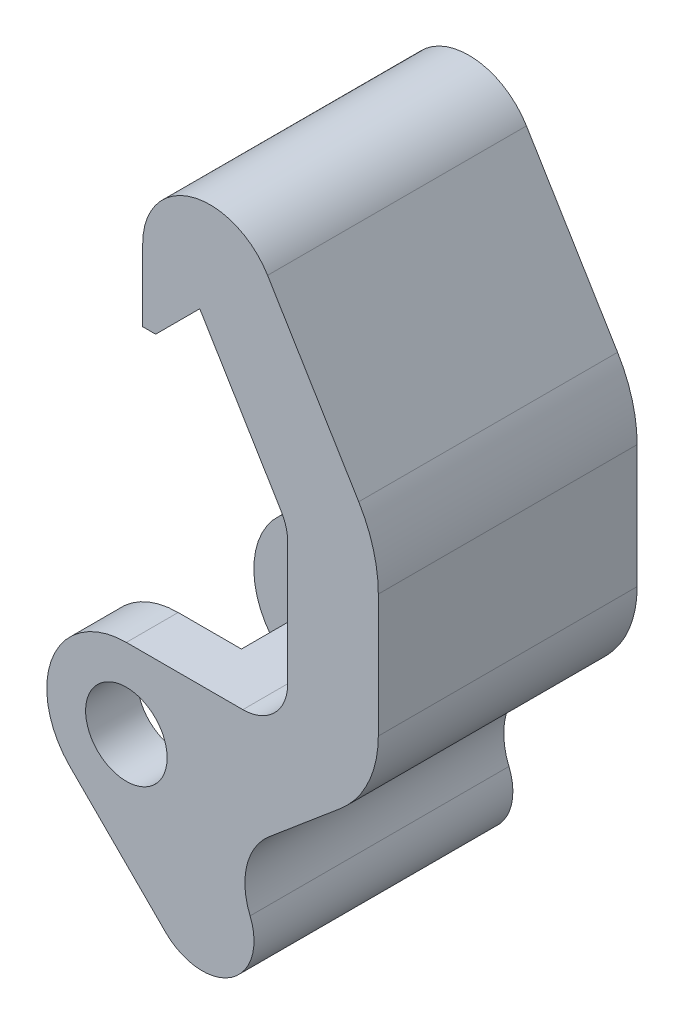
ISO-10303-21;
HEADER;
FILE_DESCRIPTION(('STEP AP214'),'2;1');
FILE_NAME('part.step','',(''),(''),'','','');
FILE_SCHEMA(('AUTOMOTIVE_DESIGN { 1 0 10303 214 1 1 1 1 }'));
ENDSEC;
DATA;
#1=APPLICATION_CONTEXT('core data for automotive mechanical design processes');
#2=APPLICATION_PROTOCOL_DEFINITION('international standard','automotive_design',2000,#1);
#3=PRODUCT_CONTEXT('',#1,'mechanical');
#4=PRODUCT('Part','Part','',(#3));
#5=PRODUCT_RELATED_PRODUCT_CATEGORY('part','',(#4));
#6=PRODUCT_DEFINITION_FORMATION('','',#4);
#7=PRODUCT_DEFINITION_CONTEXT('part definition',#1,'design');
#8=PRODUCT_DEFINITION('design','',#6,#7);
#9=PRODUCT_DEFINITION_SHAPE('','',#8);
#10=(LENGTH_UNIT() NAMED_UNIT(*) SI_UNIT(.MILLI.,.METRE.));
#11=(NAMED_UNIT(*) PLANE_ANGLE_UNIT() SI_UNIT($,.RADIAN.));
#12=(NAMED_UNIT(*) SI_UNIT($,.STERADIAN.) SOLID_ANGLE_UNIT());
#13=UNCERTAINTY_MEASURE_WITH_UNIT(LENGTH_MEASURE(1.E-05),#10,'distance_accuracy_value','');
#14=(GEOMETRIC_REPRESENTATION_CONTEXT(3) GLOBAL_UNCERTAINTY_ASSIGNED_CONTEXT((#13)) GLOBAL_UNIT_ASSIGNED_CONTEXT((#10,
#11,#12)) REPRESENTATION_CONTEXT('',''));
#15=CARTESIAN_POINT('',(0.,0.,0.));
#16=DIRECTION('',(0.,0.,1.));
#17=DIRECTION('',(1.,0.,0.));
#18=AXIS2_PLACEMENT_3D('',#15,#16,#17);
#19=CARTESIAN_POINT('',(0.,3.075,5.));
#20=DIRECTION('',(0.,-1.,0.));
#21=DIRECTION('',(1.,0.,0.));
#22=AXIS2_PLACEMENT_3D('',#19,#20,#21);
#23=PLANE('',#22);
#24=DIRECTION('',(-1.,0.,0.));
#25=VECTOR('',#24,1.);
#26=CARTESIAN_POINT('',(0.,3.075,-3.));
#27=LINE('',#26,#25);
#28=CARTESIAN_POINT('',(2.44513023030322,3.075,-3.));
#29=VERTEX_POINT('',#28);
#30=CARTESIAN_POINT('',(0.,3.075,-3.));
#31=VERTEX_POINT('',#30);
#32=EDGE_CURVE('E275',#29,#31,#27,.T.);
#33=ORIENTED_EDGE('',*,*,#32,.F.);
#34=DIRECTION('',(0.,0.,1.));
#35=VECTOR('',#34,1.);
#36=CARTESIAN_POINT('',(2.44513023030322,3.075,-3.));
#37=LINE('',#36,#35);
#38=CARTESIAN_POINT('',(2.44513023030322,3.075,3.));
#39=VERTEX_POINT('',#38);
#40=EDGE_CURVE('E278',#29,#39,#37,.T.);
#41=ORIENTED_EDGE('',*,*,#40,.T.);
#42=DIRECTION('',(-1.,0.,0.));
#43=VECTOR('',#42,1.);
#44=CARTESIAN_POINT('',(0.,3.075,3.));
#45=LINE('',#44,#43);
#46=CARTESIAN_POINT('',(0.,3.075,3.));
#47=VERTEX_POINT('',#46);
#48=EDGE_CURVE('E256',#39,#47,#45,.T.);
#49=ORIENTED_EDGE('',*,*,#48,.T.);
#50=DIRECTION('',(0.,0.,-1.));
#51=VECTOR('',#50,1.);
#52=CARTESIAN_POINT('',(0.,3.075,5.));
#53=LINE('',#52,#51);
#54=CARTESIAN_POINT('',(0.,3.075,5.));
#55=VERTEX_POINT('',#54);
#56=EDGE_CURVE('E209',#55,#47,#53,.T.);
#57=ORIENTED_EDGE('',*,*,#56,.F.);
#58=DIRECTION('',(-1.,0.,0.));
#59=VECTOR('',#58,1.);
#60=CARTESIAN_POINT('',(0.,3.075,5.));
#61=LINE('',#60,#59);
#62=CARTESIAN_POINT('',(4.5,3.075,5.));
#63=VERTEX_POINT('',#62);
#64=EDGE_CURVE('E323',#63,#55,#61,.T.);
#65=ORIENTED_EDGE('',*,*,#64,.F.);
#66=DIRECTION('',(0.,0.,-1.));
#67=VECTOR('',#66,1.);
#68=CARTESIAN_POINT('',(4.5,3.075,5.));
#69=LINE('',#68,#67);
#70=CARTESIAN_POINT('',(4.5,3.075,-5.));
#71=VERTEX_POINT('',#70);
#72=EDGE_CURVE('E212',#63,#71,#69,.T.);
#73=ORIENTED_EDGE('',*,*,#72,.T.);
#74=DIRECTION('',(-1.,0.,0.));
#75=VECTOR('',#74,1.);
#76=CARTESIAN_POINT('',(0.,3.075,-5.));
#77=LINE('',#76,#75);
#78=CARTESIAN_POINT('',(0.,3.075,-5.));
#79=VERTEX_POINT('',#78);
#80=EDGE_CURVE('E368',#71,#79,#77,.T.);
#81=ORIENTED_EDGE('',*,*,#80,.T.);
#82=EDGE_CURVE('E208',#31,#79,#53,.T.);
#83=ORIENTED_EDGE('',*,*,#82,.F.);
#84=EDGE_LOOP('',(#33,#41,#49,#57,#65,#73,#81,#83));
#85=FACE_BOUND('',#84,.T.);
#86=ADVANCED_FACE('F38',(#85),#23,.F.);
#87=CARTESIAN_POINT('',(0.,0.,5.));
#88=DIRECTION('',(0.,0.,-1.));
#89=DIRECTION('',(-1.,0.,0.));
#90=AXIS2_PLACEMENT_3D('',#87,#88,#89);
#91=CYLINDRICAL_SURFACE('',#90,3.075);
#92=CARTESIAN_POINT('',(0.,0.,-3.));
#93=DIRECTION('',(0.,0.,1.));
#94=DIRECTION('',(1.,0.,0.));
#95=AXIS2_PLACEMENT_3D('',#92,#93,#94);
#96=CIRCLE('',#95,3.075);
#97=CARTESIAN_POINT('',(-2.17435335214862,-2.17435335214865,-3.));
#98=VERTEX_POINT('',#97);
#99=EDGE_CURVE('E260',#31,#98,#96,.T.);
#100=ORIENTED_EDGE('',*,*,#99,.F.);
#101=ORIENTED_EDGE('',*,*,#82,.T.);
#102=CARTESIAN_POINT('',(0.,0.,-5.));
#103=DIRECTION('',(0.,0.,1.));
#104=DIRECTION('',(1.,0.,0.));
#105=AXIS2_PLACEMENT_3D('',#102,#103,#104);
#106=CIRCLE('',#105,3.075);
#107=CARTESIAN_POINT('',(-2.17435335214862,-2.17435335214865,-5.));
#108=VERTEX_POINT('',#107);
#109=EDGE_CURVE('E371',#79,#108,#106,.T.);
#110=ORIENTED_EDGE('',*,*,#109,.T.);
#111=DIRECTION('',(0.,0.,-1.));
#112=VECTOR('',#111,1.);
#113=CARTESIAN_POINT('',(-2.17435335214862,-2.17435335214865,5.));
#114=LINE('',#113,#112);
#115=EDGE_CURVE('E201',#98,#108,#114,.T.);
#116=ORIENTED_EDGE('',*,*,#115,.F.);
#117=EDGE_LOOP('',(#100,#101,#110,#116));
#118=FACE_BOUND('',#117,.T.);
#119=ADVANCED_FACE('F395',(#118),#91,.T.);
#120=CARTESIAN_POINT('',(-2.17435335214862,-2.17435335214865,5.));
#121=DIRECTION('',(0.707106781186544,0.707106781186551,0.));
#122=DIRECTION('',(-0.707106781186551,0.707106781186544,0.));
#123=AXIS2_PLACEMENT_3D('',#120,#121,#122);
#124=PLANE('',#123);
#125=DIRECTION('',(0.707106781186551,-0.707106781186544,0.));
#126=VECTOR('',#125,1.);
#127=CARTESIAN_POINT('',(-2.17435335214862,-2.17435335214865,-3.));
#128=LINE('',#127,#126);
#129=CARTESIAN_POINT('',(-0.445385185416979,-3.90332151888027,-3.));
#130=VERTEX_POINT('',#129);
#131=EDGE_CURVE('E255',#98,#130,#128,.T.);
#132=ORIENTED_EDGE('',*,*,#131,.F.);
#133=ORIENTED_EDGE('',*,*,#115,.T.);
#134=DIRECTION('',(0.707106781186551,-0.707106781186544,0.));
#135=VECTOR('',#134,1.);
#136=CARTESIAN_POINT('',(-2.17435335214862,-2.17435335214865,-5.));
#137=LINE('',#136,#135);
#138=CARTESIAN_POINT('',(1.5171263132626,-5.86583301755982,-5.));
#139=VERTEX_POINT('',#138);
#140=EDGE_CURVE('E200',#108,#139,#137,.T.);
#141=ORIENTED_EDGE('',*,*,#140,.T.);
#142=DIRECTION('',(0.,0.,-1.));
#143=VECTOR('',#142,1.);
#144=CARTESIAN_POINT('',(1.5171263132626,-5.86583301755982,5.));
#145=LINE('',#144,#143);
#146=CARTESIAN_POINT('',(1.5171263132626,-5.86583301755982,5.));
#147=VERTEX_POINT('',#146);
#148=EDGE_CURVE('E183',#147,#139,#145,.T.);
#149=ORIENTED_EDGE('',*,*,#148,.F.);
#150=DIRECTION('',(0.707106781186551,-0.707106781186544,0.));
#151=VECTOR('',#150,1.);
#152=CARTESIAN_POINT('',(-2.17435335214862,-2.17435335214865,5.));
#153=LINE('',#152,#151);
#154=CARTESIAN_POINT('',(-2.17435335214862,-2.17435335214865,5.));
#155=VERTEX_POINT('',#154);
#156=EDGE_CURVE('E187',#155,#147,#153,.T.);
#157=ORIENTED_EDGE('',*,*,#156,.F.);
#158=CARTESIAN_POINT('',(-2.17435335214862,-2.17435335214865,3.));
#159=VERTEX_POINT('',#158);
#160=EDGE_CURVE('E203',#155,#159,#114,.T.);
#161=ORIENTED_EDGE('',*,*,#160,.T.);
#162=DIRECTION('',(0.707106781186551,-0.707106781186544,0.));
#163=VECTOR('',#162,1.);
#164=CARTESIAN_POINT('',(-2.17435335214862,-2.17435335214865,3.));
#165=LINE('',#164,#163);
#166=CARTESIAN_POINT('',(-0.445385185416979,-3.90332151888027,3.));
#167=VERTEX_POINT('',#166);
#168=EDGE_CURVE('E251',#159,#167,#165,.T.);
#169=ORIENTED_EDGE('',*,*,#168,.T.);
#170=DIRECTION('',(0.,0.,1.));
#171=VECTOR('',#170,1.);
#172=CARTESIAN_POINT('',(-0.445385185416979,-3.90332151888027,-3.));
#173=LINE('',#172,#171);
#174=EDGE_CURVE('E11',#167,#130,#173,.F.);
#175=ORIENTED_EDGE('',*,*,#174,.T.);
#176=EDGE_LOOP('',(#132,#133,#141,#149,#157,#161,#169,#175));
#177=FACE_BOUND('',#176,.T.);
#178=ADVANCED_FACE('F198',(#177),#124,.F.);
#179=CARTESIAN_POINT('',(0.,0.,5.));
#180=DIRECTION('',(0.,0.,-1.));
#181=DIRECTION('',(-1.,0.,0.));
#182=AXIS2_PLACEMENT_3D('',#179,#180,#181);
#183=CYLINDRICAL_SURFACE('',#182,1.575);
#184=CARTESIAN_POINT('',(0.,0.,-5.));
#185=DIRECTION('',(0.,0.,1.));
#186=DIRECTION('',(1.,0.,0.));
#187=AXIS2_PLACEMENT_3D('',#184,#185,#186);
#188=CIRCLE('',#187,1.575);
#189=CARTESIAN_POINT('',(1.575,0.,-5.));
#190=VERTEX_POINT('',#189);
#191=EDGE_CURVE('E280',#190,#190,#188,.T.);
#192=ORIENTED_EDGE('',*,*,#191,.F.);
#193=EDGE_LOOP('',(#192));
#194=FACE_BOUND('',#193,.T.);
#195=CARTESIAN_POINT('',(0.,0.,-3.));
#196=DIRECTION('',(0.,0.,1.));
#197=DIRECTION('',(1.,0.,0.));
#198=AXIS2_PLACEMENT_3D('',#195,#196,#197);
#199=CIRCLE('',#198,1.575);
#200=CARTESIAN_POINT('',(1.575,0.,-3.));
#201=VERTEX_POINT('',#200);
#202=EDGE_CURVE('E253',#201,#201,#199,.T.);
#203=ORIENTED_EDGE('',*,*,#202,.T.);
#204=EDGE_LOOP('',(#203));
#205=FACE_BOUND('',#204,.T.);
#206=ADVANCED_FACE('F385',(#194,#205),#183,.F.);
#207=CARTESIAN_POINT('',(2.61848265699495,-3.10888468855235,5.));
#208=DIRECTION('',(0.644204044734326,-0.764853677998566,0.));
#209=DIRECTION('',(0.764853677998566,0.644204044734326,0.));
#210=AXIS2_PLACEMENT_3D('',#207,#208,#209);
#211=PLANE('',#210);
#212=DIRECTION('',(-0.764853677998566,-0.644204044734326,0.));
#213=VECTOR('',#212,1.);
#214=CARTESIAN_POINT('',(2.61848265699495,-3.10888468855235,-5.));
#215=LINE('',#214,#213);
#216=CARTESIAN_POINT('',(8.26048453199489,1.64313590417654,-5.));
#217=VERTEX_POINT('',#216);
#218=CARTESIAN_POINT('',(5.51326964630779,-0.670727507901209,-5.));
#219=VERTEX_POINT('',#218);
#220=EDGE_CURVE('E329',#217,#219,#215,.T.);
#221=ORIENTED_EDGE('',*,*,#220,.F.);
#222=DIRECTION('',(0.,0.,-1.));
#223=VECTOR('',#222,1.);
#224=CARTESIAN_POINT('',(8.26048453199489,1.64313590417654,5.));
#225=LINE('',#224,#223);
#226=CARTESIAN_POINT('',(8.26048453199489,1.64313590417654,5.));
#227=VERTEX_POINT('',#226);
#228=EDGE_CURVE('E46',#227,#217,#225,.T.);
#229=ORIENTED_EDGE('',*,*,#228,.F.);
#230=DIRECTION('',(-0.764853677998566,-0.644204044734326,0.));
#231=VECTOR('',#230,1.);
#232=CARTESIAN_POINT('',(2.61848265699495,-3.10888468855235,5.));
#233=LINE('',#232,#231);
#234=CARTESIAN_POINT('',(5.51326964630779,-0.670727507901209,5.));
#235=VERTEX_POINT('',#234);
#236=EDGE_CURVE('E284',#227,#235,#233,.T.);
#237=ORIENTED_EDGE('',*,*,#236,.T.);
#238=DIRECTION('',(0.,0.,-1.));
#239=VECTOR('',#238,1.);
#240=CARTESIAN_POINT('',(5.51326964630779,-0.670727507901209,5.));
#241=LINE('',#240,#239);
#242=EDGE_CURVE('E125',#235,#219,#241,.T.);
#243=ORIENTED_EDGE('',*,*,#242,.T.);
#244=EDGE_LOOP('',(#221,#229,#237,#243));
#245=FACE_BOUND('',#244,.T.);
#246=ADVANCED_FACE('F382',(#245),#211,.T.);
#247=CARTESIAN_POINT('',(5.59529140507463,4.80747922422185,5.));
#248=DIRECTION('',(0.,0.,-1.));
#249=DIRECTION('',(-1.,0.,0.));
#250=AXIS2_PLACEMENT_3D('',#247,#248,#249);
#251=CYLINDRICAL_SURFACE('',#250,4.13718781914711);
#252=CARTESIAN_POINT('',(5.59529140507463,4.80747922422185,-5.));
#253=DIRECTION('',(0.,0.,1.));
#254=DIRECTION('',(1.,0.,0.));
#255=AXIS2_PLACEMENT_3D('',#252,#253,#254);
#256=CIRCLE('',#255,4.13718781914711);
#257=CARTESIAN_POINT('',(9.73247922422185,4.80747922422208,-5.));
#258=VERTEX_POINT('',#257);
#259=EDGE_CURVE('E332',#217,#258,#256,.T.);
#260=ORIENTED_EDGE('',*,*,#259,.T.);
#261=DIRECTION('',(0.,0.,-1.));
#262=VECTOR('',#261,1.);
#263=CARTESIAN_POINT('',(9.73247922422185,4.80747922422208,5.));
#264=LINE('',#263,#262);
#265=CARTESIAN_POINT('',(9.73247922422185,4.80747922422208,5.));
#266=VERTEX_POINT('',#265);
#267=EDGE_CURVE('E245',#266,#258,#264,.T.);
#268=ORIENTED_EDGE('',*,*,#267,.F.);
#269=CARTESIAN_POINT('',(5.59529140507463,4.80747922422185,5.));
#270=DIRECTION('',(0.,0.,1.));
#271=DIRECTION('',(1.,0.,0.));
#272=AXIS2_PLACEMENT_3D('',#269,#270,#271);
#273=CIRCLE('',#272,4.13718781914711);
#274=EDGE_CURVE('E287',#227,#266,#273,.T.);
#275=ORIENTED_EDGE('',*,*,#274,.F.);
#276=ORIENTED_EDGE('',*,*,#228,.T.);
#277=EDGE_LOOP('',(#260,#268,#275,#276));
#278=FACE_BOUND('',#277,.T.);
#279=ADVANCED_FACE('F384',(#278),#251,.T.);
#280=CARTESIAN_POINT('',(9.73247922422185,0.,5.));
#281=DIRECTION('',(-1.,0.,0.));
#282=DIRECTION('',(0.,-1.,0.));
#283=AXIS2_PLACEMENT_3D('',#280,#281,#282);
#284=PLANE('',#283);
#285=DIRECTION('',(0.,1.,0.));
#286=VECTOR('',#285,1.);
#287=CARTESIAN_POINT('',(9.73247922422185,0.,-5.));
#288=LINE('',#287,#286);
#289=CARTESIAN_POINT('',(9.73247922422185,9.55747922422185,-5.));
#290=VERTEX_POINT('',#289);
#291=EDGE_CURVE('E335',#258,#290,#288,.T.);
#292=ORIENTED_EDGE('',*,*,#291,.T.);
#293=DIRECTION('',(0.,0.,-1.));
#294=VECTOR('',#293,1.);
#295=CARTESIAN_POINT('',(9.73247922422185,9.55747922422185,5.));
#296=LINE('',#295,#294);
#297=CARTESIAN_POINT('',(9.73247922422185,9.55747922422185,5.));
#298=VERTEX_POINT('',#297);
#299=EDGE_CURVE('E242',#298,#290,#296,.T.);
#300=ORIENTED_EDGE('',*,*,#299,.F.);
#301=DIRECTION('',(0.,1.,0.));
#302=VECTOR('',#301,1.);
#303=CARTESIAN_POINT('',(9.73247922422185,0.,5.));
#304=LINE('',#303,#302);
#305=EDGE_CURVE('E290',#266,#298,#304,.T.);
#306=ORIENTED_EDGE('',*,*,#305,.F.);
#307=ORIENTED_EDGE('',*,*,#267,.T.);
#308=EDGE_LOOP('',(#292,#300,#306,#307));
#309=FACE_BOUND('',#308,.T.);
#310=ADVANCED_FACE('F390',(#309),#284,.F.);
#311=CARTESIAN_POINT('',(4.5,9.55747922422185,5.));
#312=DIRECTION('',(0.,0.,-1.));
#313=DIRECTION('',(-1.,0.,0.));
#314=AXIS2_PLACEMENT_3D('',#311,#312,#313);
#315=CYLINDRICAL_SURFACE('',#314,5.23247922422185);
#316=CARTESIAN_POINT('',(4.5,9.55747922422185,-5.));
#317=DIRECTION('',(0.,0.,1.));
#318=DIRECTION('',(1.,0.,0.));
#319=AXIS2_PLACEMENT_3D('',#316,#317,#318);
#320=CIRCLE('',#319,5.23247922422185);
#321=CARTESIAN_POINT('',(8.97613150360783,12.2672920580395,-5.));
#322=VERTEX_POINT('',#321);
#323=EDGE_CURVE('E338',#290,#322,#320,.T.);
#324=ORIENTED_EDGE('',*,*,#323,.T.);
#325=DIRECTION('',(0.,0.,-1.));
#326=VECTOR('',#325,1.);
#327=CARTESIAN_POINT('',(8.97613150360783,12.2672920580395,5.));
#328=LINE('',#327,#326);
#329=CARTESIAN_POINT('',(8.97613150360783,12.2672920580395,5.));
#330=VERTEX_POINT('',#329);
#331=EDGE_CURVE('E239',#330,#322,#328,.T.);
#332=ORIENTED_EDGE('',*,*,#331,.F.);
#333=CARTESIAN_POINT('',(4.5,9.55747922422185,5.));
#334=DIRECTION('',(0.,0.,1.));
#335=DIRECTION('',(1.,0.,0.));
#336=AXIS2_PLACEMENT_3D('',#333,#334,#335);
#337=CIRCLE('',#336,5.23247922422185);
#338=EDGE_CURVE('E293',#298,#330,#337,.T.);
#339=ORIENTED_EDGE('',*,*,#338,.F.);
#340=ORIENTED_EDGE('',*,*,#299,.T.);
#341=EDGE_LOOP('',(#324,#332,#339,#340));
#342=FACE_BOUND('',#341,.T.);
#343=ADVANCED_FACE('F441',(#342),#315,.T.);
#344=CARTESIAN_POINT('',(12.0034094316589,7.26676437036306,5.));
#345=DIRECTION('',(-0.855451366703419,-0.517883152077041,0.));
#346=DIRECTION('',(0.517883152077041,-0.855451366703419,0.));
#347=AXIS2_PLACEMENT_3D('',#344,#345,#346);
#348=PLANE('',#347);
#349=DIRECTION('',(-0.517883152077041,0.855451366703419,0.));
#350=VECTOR('',#349,1.);
#351=CARTESIAN_POINT('',(12.0034094316589,7.26676437036306,-5.));
#352=LINE('',#351,#350);
#353=CARTESIAN_POINT('',(5.45563764844864,18.0825252197835,-5.));
#354=VERTEX_POINT('',#353);
#355=EDGE_CURVE('E341',#322,#354,#352,.T.);
#356=ORIENTED_EDGE('',*,*,#355,.T.);
#357=DIRECTION('',(0.,0.,-1.));
#358=VECTOR('',#357,1.);
#359=CARTESIAN_POINT('',(5.45563764844864,18.0825252197835,5.));
#360=LINE('',#359,#358);
#361=CARTESIAN_POINT('',(5.45563764844864,18.0825252197835,5.));
#362=VERTEX_POINT('',#361);
#363=EDGE_CURVE('E236',#362,#354,#360,.T.);
#364=ORIENTED_EDGE('',*,*,#363,.F.);
#365=DIRECTION('',(-0.517883152077041,0.855451366703419,0.));
#366=VECTOR('',#365,1.);
#367=CARTESIAN_POINT('',(12.0034094316589,7.26676437036306,5.));
#368=LINE('',#367,#366);
#369=EDGE_CURVE('E296',#330,#362,#368,.T.);
#370=ORIENTED_EDGE('',*,*,#369,.F.);
#371=ORIENTED_EDGE('',*,*,#331,.T.);
#372=EDGE_LOOP('',(#356,#364,#370,#371));
#373=FACE_BOUND('',#372,.T.);
#374=ADVANCED_FACE('F437',(#373),#348,.F.);
#375=CARTESIAN_POINT('',(3.23135063648235,16.735960337527,5.));
#376=DIRECTION('',(0.,0.,-1.));
#377=DIRECTION('',(-1.,0.,0.));
#378=AXIS2_PLACEMENT_3D('',#375,#376,#377);
#379=CYLINDRICAL_SURFACE('',#378,2.60013263002645);
#380=CARTESIAN_POINT('',(3.23135063648235,16.735960337527,-5.));
#381=DIRECTION('',(0.,0.,1.));
#382=DIRECTION('',(1.,0.,0.));
#383=AXIS2_PLACEMENT_3D('',#380,#381,#382);
#384=CIRCLE('',#383,2.60013263002645);
#385=CARTESIAN_POINT('',(0.631218006455897,16.735960337527,-5.));
#386=VERTEX_POINT('',#385);
#387=EDGE_CURVE('E344',#354,#386,#384,.T.);
#388=ORIENTED_EDGE('',*,*,#387,.T.);
#389=DIRECTION('',(0.,0.,-1.));
#390=VECTOR('',#389,1.);
#391=CARTESIAN_POINT('',(0.631218006455897,16.735960337527,5.));
#392=LINE('',#391,#390);
#393=CARTESIAN_POINT('',(0.631218006455897,16.735960337527,5.));
#394=VERTEX_POINT('',#393);
#395=EDGE_CURVE('E233',#394,#386,#392,.T.);
#396=ORIENTED_EDGE('',*,*,#395,.F.);
#397=CARTESIAN_POINT('',(3.23135063648235,16.735960337527,5.));
#398=DIRECTION('',(0.,0.,1.));
#399=DIRECTION('',(1.,0.,0.));
#400=AXIS2_PLACEMENT_3D('',#397,#398,#399);
#401=CIRCLE('',#400,2.60013263002645);
#402=EDGE_CURVE('E299',#362,#394,#401,.T.);
#403=ORIENTED_EDGE('',*,*,#402,.F.);
#404=ORIENTED_EDGE('',*,*,#363,.T.);
#405=EDGE_LOOP('',(#388,#396,#403,#404));
#406=FACE_BOUND('',#405,.T.);
#407=ADVANCED_FACE('F433',(#406),#379,.T.);
#408=CARTESIAN_POINT('',(0.631218006455931,0.,5.));
#409=DIRECTION('',(1.,0.,0.));
#410=DIRECTION('',(0.,1.,0.));
#411=AXIS2_PLACEMENT_3D('',#408,#409,#410);
#412=PLANE('',#411);
#413=DIRECTION('',(0.,-1.,0.));
#414=VECTOR('',#413,1.);
#415=CARTESIAN_POINT('',(0.631218006455931,0.,-5.));
#416=LINE('',#415,#414);
#417=CARTESIAN_POINT('',(0.631218006455902,13.9500746322776,-5.));
#418=VERTEX_POINT('',#417);
#419=EDGE_CURVE('E347',#386,#418,#416,.T.);
#420=ORIENTED_EDGE('',*,*,#419,.T.);
#421=DIRECTION('',(0.,0.,-1.));
#422=VECTOR('',#421,1.);
#423=CARTESIAN_POINT('',(0.631218006455902,13.9500746322776,5.));
#424=LINE('',#423,#422);
#425=CARTESIAN_POINT('',(0.631218006455902,13.9500746322776,5.));
#426=VERTEX_POINT('',#425);
#427=EDGE_CURVE('E230',#426,#418,#424,.T.);
#428=ORIENTED_EDGE('',*,*,#427,.F.);
#429=DIRECTION('',(0.,-1.,0.));
#430=VECTOR('',#429,1.);
#431=CARTESIAN_POINT('',(0.631218006455931,0.,5.));
#432=LINE('',#431,#430);
#433=EDGE_CURVE('E302',#394,#426,#432,.T.);
#434=ORIENTED_EDGE('',*,*,#433,.F.);
#435=ORIENTED_EDGE('',*,*,#395,.T.);
#436=EDGE_LOOP('',(#420,#428,#434,#435));
#437=FACE_BOUND('',#436,.T.);
#438=ADVANCED_FACE('F429',(#437),#412,.F.);
#439=CARTESIAN_POINT('',(0.,13.9500746322776,5.));
#440=DIRECTION('',(0.,1.,0.));
#441=DIRECTION('',(-1.,0.,0.));
#442=AXIS2_PLACEMENT_3D('',#439,#440,#441);
#443=PLANE('',#442);
#444=DIRECTION('',(1.,0.,0.));
#445=VECTOR('',#444,1.);
#446=CARTESIAN_POINT('',(0.,13.9500746322776,-5.));
#447=LINE('',#446,#445);
#448=CARTESIAN_POINT('',(1.1312180064559,13.9500746322776,-5.));
#449=VERTEX_POINT('',#448);
#450=EDGE_CURVE('E350',#418,#449,#447,.T.);
#451=ORIENTED_EDGE('',*,*,#450,.T.);
#452=DIRECTION('',(0.,0.,-1.));
#453=VECTOR('',#452,1.);
#454=CARTESIAN_POINT('',(1.1312180064559,13.9500746322776,5.));
#455=LINE('',#454,#453);
#456=CARTESIAN_POINT('',(1.1312180064559,13.9500746322776,5.));
#457=VERTEX_POINT('',#456);
#458=EDGE_CURVE('E227',#457,#449,#455,.T.);
#459=ORIENTED_EDGE('',*,*,#458,.F.);
#460=DIRECTION('',(1.,0.,0.));
#461=VECTOR('',#460,1.);
#462=CARTESIAN_POINT('',(0.,13.9500746322776,5.));
#463=LINE('',#462,#461);
#464=EDGE_CURVE('E305',#426,#457,#463,.T.);
#465=ORIENTED_EDGE('',*,*,#464,.F.);
#466=ORIENTED_EDGE('',*,*,#427,.T.);
#467=EDGE_LOOP('',(#451,#459,#465,#466));
#468=FACE_BOUND('',#467,.T.);
#469=ADVANCED_FACE('F425',(#468),#443,.F.);
#470=CARTESIAN_POINT('',(-6.40942831291084,6.40942831291077,5.));
#471=DIRECTION('',(-0.707106781186551,0.707106781186544,0.));
#472=DIRECTION('',(-0.707106781186544,-0.707106781186551,0.));
#473=AXIS2_PLACEMENT_3D('',#470,#471,#472);
#474=PLANE('',#473);
#475=DIRECTION('',(0.707106781186544,0.707106781186551,0.));
#476=VECTOR('',#475,1.);
#477=CARTESIAN_POINT('',(-6.40942831291084,6.40942831291077,-5.));
#478=LINE('',#477,#476);
#479=CARTESIAN_POINT('',(2.83470480956883,15.6535614353905,-5.));
#480=VERTEX_POINT('',#479);
#481=EDGE_CURVE('E353',#449,#480,#478,.T.);
#482=ORIENTED_EDGE('',*,*,#481,.T.);
#483=DIRECTION('',(0.,0.,-1.));
#484=VECTOR('',#483,1.);
#485=CARTESIAN_POINT('',(2.83470480956883,15.6535614353905,5.));
#486=LINE('',#485,#484);
#487=CARTESIAN_POINT('',(2.83470480956883,15.6535614353905,5.));
#488=VERTEX_POINT('',#487);
#489=EDGE_CURVE('E224',#488,#480,#486,.T.);
#490=ORIENTED_EDGE('',*,*,#489,.F.);
#491=DIRECTION('',(0.707106781186544,0.707106781186551,0.));
#492=VECTOR('',#491,1.);
#493=CARTESIAN_POINT('',(-6.40942831291084,6.40942831291077,5.));
#494=LINE('',#493,#492);
#495=EDGE_CURVE('E308',#457,#488,#494,.T.);
#496=ORIENTED_EDGE('',*,*,#495,.F.);
#497=ORIENTED_EDGE('',*,*,#458,.T.);
#498=EDGE_LOOP('',(#482,#490,#496,#497));
#499=FACE_BOUND('',#498,.T.);
#500=ADVANCED_FACE('F421',(#499),#474,.F.);
#501=CARTESIAN_POINT('',(9.00932964819693,5.45417333809341,5.));
#502=DIRECTION('',(0.85545136670342,0.517883152077041,0.));
#503=DIRECTION('',(-0.517883152077041,0.85545136670342,0.));
#504=AXIS2_PLACEMENT_3D('',#501,#502,#503);
#505=PLANE('',#504);
#506=DIRECTION('',(0.517883152077041,-0.85545136670342,0.));
#507=VECTOR('',#506,1.);
#508=CARTESIAN_POINT('',(9.00932964819693,5.45417333809341,-5.));
#509=LINE('',#508,#507);
#510=CARTESIAN_POINT('',(5.98205172014586,10.4547010257698,-5.));
#511=VERTEX_POINT('',#510);
#512=EDGE_CURVE('E356',#480,#511,#509,.T.);
#513=ORIENTED_EDGE('',*,*,#512,.T.);
#514=DIRECTION('',(0.,0.,-1.));
#515=VECTOR('',#514,1.);
#516=CARTESIAN_POINT('',(5.98205172014586,10.4547010257698,5.));
#517=LINE('',#516,#515);
#518=CARTESIAN_POINT('',(5.98205172014586,10.4547010257698,5.));
#519=VERTEX_POINT('',#518);
#520=EDGE_CURVE('E221',#519,#511,#517,.T.);
#521=ORIENTED_EDGE('',*,*,#520,.F.);
#522=DIRECTION('',(0.517883152077041,-0.85545136670342,0.));
#523=VECTOR('',#522,1.);
#524=CARTESIAN_POINT('',(9.00932964819693,5.45417333809341,5.));
#525=LINE('',#524,#523);
#526=EDGE_CURVE('E311',#488,#519,#525,.T.);
#527=ORIENTED_EDGE('',*,*,#526,.F.);
#528=ORIENTED_EDGE('',*,*,#489,.T.);
#529=EDGE_LOOP('',(#513,#521,#527,#528));
#530=FACE_BOUND('',#529,.T.);
#531=ADVANCED_FACE('F417',(#530),#505,.F.);
#532=CARTESIAN_POINT('',(4.5,9.55747922422185,5.));
#533=DIRECTION('',(0.,0.,-1.));
#534=DIRECTION('',(-1.,0.,0.));
#535=AXIS2_PLACEMENT_3D('',#532,#533,#534);
#536=CYLINDRICAL_SURFACE('',#535,1.73247922422185);
#537=CARTESIAN_POINT('',(4.5,9.55747922422185,-5.));
#538=DIRECTION('',(0.,0.,1.));
#539=DIRECTION('',(1.,0.,0.));
#540=AXIS2_PLACEMENT_3D('',#537,#538,#539);
#541=CIRCLE('',#540,1.73247922422185);
#542=CARTESIAN_POINT('',(6.23247922422185,9.55747922422185,-5.));
#543=VERTEX_POINT('',#542);
#544=EDGE_CURVE('E359',#511,#543,#541,.F.);
#545=ORIENTED_EDGE('',*,*,#544,.T.);
#546=DIRECTION('',(0.,0.,-1.));
#547=VECTOR('',#546,1.);
#548=CARTESIAN_POINT('',(6.23247922422185,9.55747922422185,5.));
#549=LINE('',#548,#547);
#550=CARTESIAN_POINT('',(6.23247922422185,9.55747922422185,5.));
#551=VERTEX_POINT('',#550);
#552=EDGE_CURVE('E218',#551,#543,#549,.T.);
#553=ORIENTED_EDGE('',*,*,#552,.F.);
#554=CARTESIAN_POINT('',(4.5,9.55747922422185,5.));
#555=DIRECTION('',(0.,0.,1.));
#556=DIRECTION('',(1.,0.,0.));
#557=AXIS2_PLACEMENT_3D('',#554,#555,#556);
#558=CIRCLE('',#557,1.73247922422185);
#559=EDGE_CURVE('E314',#519,#551,#558,.F.);
#560=ORIENTED_EDGE('',*,*,#559,.F.);
#561=ORIENTED_EDGE('',*,*,#520,.T.);
#562=EDGE_LOOP('',(#545,#553,#560,#561));
#563=FACE_BOUND('',#562,.T.);
#564=ADVANCED_FACE('F413',(#563),#536,.F.);
#565=CARTESIAN_POINT('',(6.23247922422185,0.,5.));
#566=DIRECTION('',(1.,0.,0.));
#567=DIRECTION('',(0.,1.,0.));
#568=AXIS2_PLACEMENT_3D('',#565,#566,#567);
#569=PLANE('',#568);
#570=DIRECTION('',(0.,-1.,0.));
#571=VECTOR('',#570,1.);
#572=CARTESIAN_POINT('',(6.23247922422185,0.,-5.));
#573=LINE('',#572,#571);
#574=CARTESIAN_POINT('',(6.23247922422185,4.80747922422185,-5.));
#575=VERTEX_POINT('',#574);
#576=EDGE_CURVE('E362',#543,#575,#573,.T.);
#577=ORIENTED_EDGE('',*,*,#576,.T.);
#578=DIRECTION('',(0.,0.,-1.));
#579=VECTOR('',#578,1.);
#580=CARTESIAN_POINT('',(6.23247922422185,4.80747922422185,5.));
#581=LINE('',#580,#579);
#582=CARTESIAN_POINT('',(6.23247922422185,4.80747922422185,5.));
#583=VERTEX_POINT('',#582);
#584=EDGE_CURVE('E215',#583,#575,#581,.T.);
#585=ORIENTED_EDGE('',*,*,#584,.F.);
#586=DIRECTION('',(0.,-1.,0.));
#587=VECTOR('',#586,1.);
#588=CARTESIAN_POINT('',(6.23247922422185,0.,5.));
#589=LINE('',#588,#587);
#590=EDGE_CURVE('E317',#551,#583,#589,.T.);
#591=ORIENTED_EDGE('',*,*,#590,.F.);
#592=ORIENTED_EDGE('',*,*,#552,.T.);
#593=EDGE_LOOP('',(#577,#585,#591,#592));
#594=FACE_BOUND('',#593,.T.);
#595=ADVANCED_FACE('F409',(#594),#569,.F.);
#596=CARTESIAN_POINT('',(4.5,4.80747922422185,5.));
#597=DIRECTION('',(0.,0.,-1.));
#598=DIRECTION('',(-1.,0.,0.));
#599=AXIS2_PLACEMENT_3D('',#596,#597,#598);
#600=CYLINDRICAL_SURFACE('',#599,1.73247922422185);
#601=CARTESIAN_POINT('',(4.5,4.80747922422185,-5.));
#602=DIRECTION('',(0.,0.,1.));
#603=DIRECTION('',(1.,0.,0.));
#604=AXIS2_PLACEMENT_3D('',#601,#602,#603);
#605=CIRCLE('',#604,1.73247922422185);
#606=EDGE_CURVE('E365',#575,#71,#605,.F.);
#607=ORIENTED_EDGE('',*,*,#606,.T.);
#608=ORIENTED_EDGE('',*,*,#72,.F.);
#609=CARTESIAN_POINT('',(4.5,4.80747922422185,5.));
#610=DIRECTION('',(0.,0.,1.));
#611=DIRECTION('',(1.,0.,0.));
#612=AXIS2_PLACEMENT_3D('',#609,#610,#611);
#613=CIRCLE('',#612,1.73247922422185);
#614=EDGE_CURVE('E320',#583,#63,#613,.F.);
#615=ORIENTED_EDGE('',*,*,#614,.F.);
#616=ORIENTED_EDGE('',*,*,#584,.T.);
#617=EDGE_LOOP('',(#607,#608,#615,#616));
#618=FACE_BOUND('',#617,.T.);
#619=ADVANCED_FACE('F406',(#618),#600,.F.);
#620=ORIENTED_EDGE('',*,*,#56,.T.);
#621=CARTESIAN_POINT('',(0.,0.,3.));
#622=DIRECTION('',(0.,0.,1.));
#623=DIRECTION('',(1.,0.,0.));
#624=AXIS2_PLACEMENT_3D('',#621,#622,#623);
#625=CIRCLE('',#624,3.075);
#626=EDGE_CURVE('E263',#47,#159,#625,.T.);
#627=ORIENTED_EDGE('',*,*,#626,.T.);
#628=ORIENTED_EDGE('',*,*,#160,.F.);
#629=CARTESIAN_POINT('',(0.,0.,5.));
#630=DIRECTION('',(0.,0.,1.));
#631=DIRECTION('',(1.,0.,0.));
#632=AXIS2_PLACEMENT_3D('',#629,#630,#631);
#633=CIRCLE('',#632,3.075);
#634=EDGE_CURVE('E192',#55,#155,#633,.T.);
#635=ORIENTED_EDGE('',*,*,#634,.F.);
#636=EDGE_LOOP('',(#620,#627,#628,#635));
#637=FACE_BOUND('',#636,.T.);
#638=ADVANCED_FACE('F402',(#637),#91,.T.);
#639=CARTESIAN_POINT('',(2.93133987563568,-4.45161945518671,5.));
#640=DIRECTION('',(0.,0.,-1.));
#641=DIRECTION('',(-1.,0.,0.));
#642=AXIS2_PLACEMENT_3D('',#639,#640,#641);
#643=CYLINDRICAL_SURFACE('',#642,2.);
#644=CARTESIAN_POINT('',(2.93133987563568,-4.45161945518671,-5.));
#645=DIRECTION('',(0.,0.,1.));
#646=DIRECTION('',(1.,0.,0.));
#647=AXIS2_PLACEMENT_3D('',#644,#645,#646);
#648=CIRCLE('',#647,2.);
#649=CARTESIAN_POINT('',(4.77889014227545,-3.68574870092115,-5.));
#650=VERTEX_POINT('',#649);
#651=EDGE_CURVE('E375',#139,#650,#648,.T.);
#652=ORIENTED_EDGE('',*,*,#651,.T.);
#653=DIRECTION('',(0.,0.,-1.));
#654=VECTOR('',#653,1.);
#655=CARTESIAN_POINT('',(4.77889014227545,-3.68574870092115,5.));
#656=LINE('',#655,#654);
#657=CARTESIAN_POINT('',(4.77889014227545,-3.68574870092115,5.));
#658=VERTEX_POINT('',#657);
#659=EDGE_CURVE('E186',#658,#650,#656,.T.);
#660=ORIENTED_EDGE('',*,*,#659,.F.);
#661=CARTESIAN_POINT('',(2.93133987563568,-4.45161945518671,5.));
#662=DIRECTION('',(0.,0.,1.));
#663=DIRECTION('',(1.,0.,0.));
#664=AXIS2_PLACEMENT_3D('',#661,#662,#663);
#665=CIRCLE('',#664,2.);
#666=EDGE_CURVE('E178',#147,#658,#665,.T.);
#667=ORIENTED_EDGE('',*,*,#666,.F.);
#668=ORIENTED_EDGE('',*,*,#148,.T.);
#669=EDGE_LOOP('',(#652,#660,#667,#668));
#670=FACE_BOUND('',#669,.T.);
#671=ADVANCED_FACE('F181',(#670),#643,.T.);
#672=CARTESIAN_POINT('',(0.,0.,3.));
#673=DIRECTION('',(0.,0.,1.));
#674=DIRECTION('',(1.,0.,0.));
#675=AXIS2_PLACEMENT_3D('',#672,#673,#674);
#676=CIRCLE('',#675,1.575);
#677=CARTESIAN_POINT('',(1.575,0.,3.));
#678=VERTEX_POINT('',#677);
#679=EDGE_CURVE('E249',#678,#678,#676,.T.);
#680=ORIENTED_EDGE('',*,*,#679,.F.);
#681=EDGE_LOOP('',(#680));
#682=FACE_BOUND('',#681,.T.);
#683=CARTESIAN_POINT('',(0.,0.,5.));
#684=DIRECTION('',(0.,0.,1.));
#685=DIRECTION('',(1.,0.,0.));
#686=AXIS2_PLACEMENT_3D('',#683,#684,#685);
#687=CIRCLE('',#686,1.575);
#688=CARTESIAN_POINT('',(1.575,0.,5.));
#689=VERTEX_POINT('',#688);
#690=EDGE_CURVE('E281',#689,#689,#687,.T.);
#691=ORIENTED_EDGE('',*,*,#690,.T.);
#692=EDGE_LOOP('',(#691));
#693=FACE_BOUND('',#692,.T.);
#694=ADVANCED_FACE('F40',(#682,#693),#183,.F.);
#695=CARTESIAN_POINT('',(7.20546982788287,-2.6798510819721,5.));
#696=DIRECTION('',(0.,0.,-1.));
#697=DIRECTION('',(-1.,0.,0.));
#698=AXIS2_PLACEMENT_3D('',#695,#696,#697);
#699=CYLINDRICAL_SURFACE('',#698,2.62680775665255);
#700=CARTESIAN_POINT('',(7.20546982788287,-2.6798510819721,-5.));
#701=DIRECTION('',(0.,0.,1.));
#702=DIRECTION('',(1.,0.,0.));
#703=AXIS2_PLACEMENT_3D('',#700,#701,#702);
#704=CIRCLE('',#703,2.62680775665255);
#705=EDGE_CURVE('E285',#650,#219,#704,.F.);
#706=ORIENTED_EDGE('',*,*,#705,.T.);
#707=ORIENTED_EDGE('',*,*,#242,.F.);
#708=CARTESIAN_POINT('',(7.20546982788287,-2.6798510819721,5.));
#709=DIRECTION('',(0.,0.,1.));
#710=DIRECTION('',(1.,0.,0.));
#711=AXIS2_PLACEMENT_3D('',#708,#709,#710);
#712=CIRCLE('',#711,2.62680775665255);
#713=EDGE_CURVE('E62',#658,#235,#712,.F.);
#714=ORIENTED_EDGE('',*,*,#713,.F.);
#715=ORIENTED_EDGE('',*,*,#659,.T.);
#716=EDGE_LOOP('',(#706,#707,#714,#715));
#717=FACE_BOUND('',#716,.T.);
#718=ADVANCED_FACE('F378',(#717),#699,.F.);
#719=CARTESIAN_POINT('',(0.,0.,5.));
#720=DIRECTION('',(0.,0.,1.));
#721=DIRECTION('',(1.,0.,0.));
#722=AXIS2_PLACEMENT_3D('',#719,#720,#721);
#723=PLANE('',#722);
#724=ORIENTED_EDGE('',*,*,#690,.F.);
#725=EDGE_LOOP('',(#724));
#726=FACE_BOUND('',#725,.T.);
#727=ORIENTED_EDGE('',*,*,#236,.F.);
#728=ORIENTED_EDGE('',*,*,#274,.T.);
#729=ORIENTED_EDGE('',*,*,#305,.T.);
#730=ORIENTED_EDGE('',*,*,#338,.T.);
#731=ORIENTED_EDGE('',*,*,#369,.T.);
#732=ORIENTED_EDGE('',*,*,#402,.T.);
#733=ORIENTED_EDGE('',*,*,#433,.T.);
#734=ORIENTED_EDGE('',*,*,#464,.T.);
#735=ORIENTED_EDGE('',*,*,#495,.T.);
#736=ORIENTED_EDGE('',*,*,#526,.T.);
#737=ORIENTED_EDGE('',*,*,#559,.T.);
#738=ORIENTED_EDGE('',*,*,#590,.T.);
#739=ORIENTED_EDGE('',*,*,#614,.T.);
#740=ORIENTED_EDGE('',*,*,#64,.T.);
#741=ORIENTED_EDGE('',*,*,#634,.T.);
#742=ORIENTED_EDGE('',*,*,#156,.T.);
#743=ORIENTED_EDGE('',*,*,#666,.T.);
#744=ORIENTED_EDGE('',*,*,#713,.T.);
#745=EDGE_LOOP('',(#727,#728,#729,#730,#731,#732,#733,#734,#735,#736,#737,#738,#739,#740,#741,
#742,#743,#744));
#746=FACE_BOUND('',#745,.T.);
#747=ADVANCED_FACE('F190',(#726,#746),#723,.T.);
#748=CARTESIAN_POINT('',(0.,0.,-5.));
#749=DIRECTION('',(0.,0.,1.));
#750=DIRECTION('',(1.,0.,0.));
#751=AXIS2_PLACEMENT_3D('',#748,#749,#750);
#752=PLANE('',#751);
#753=ORIENTED_EDGE('',*,*,#191,.T.);
#754=EDGE_LOOP('',(#753));
#755=FACE_BOUND('',#754,.T.);
#756=ORIENTED_EDGE('',*,*,#220,.T.);
#757=ORIENTED_EDGE('',*,*,#705,.F.);
#758=ORIENTED_EDGE('',*,*,#651,.F.);
#759=ORIENTED_EDGE('',*,*,#140,.F.);
#760=ORIENTED_EDGE('',*,*,#109,.F.);
#761=ORIENTED_EDGE('',*,*,#80,.F.);
#762=ORIENTED_EDGE('',*,*,#606,.F.);
#763=ORIENTED_EDGE('',*,*,#576,.F.);
#764=ORIENTED_EDGE('',*,*,#544,.F.);
#765=ORIENTED_EDGE('',*,*,#512,.F.);
#766=ORIENTED_EDGE('',*,*,#481,.F.);
#767=ORIENTED_EDGE('',*,*,#450,.F.);
#768=ORIENTED_EDGE('',*,*,#419,.F.);
#769=ORIENTED_EDGE('',*,*,#387,.F.);
#770=ORIENTED_EDGE('',*,*,#355,.F.);
#771=ORIENTED_EDGE('',*,*,#323,.F.);
#772=ORIENTED_EDGE('',*,*,#291,.F.);
#773=ORIENTED_EDGE('',*,*,#259,.F.);
#774=EDGE_LOOP('',(#756,#757,#758,#759,#760,#761,#762,#763,#764,#765,#766,#767,#768,#769,#770,
#771,#772,#773));
#775=FACE_BOUND('',#774,.T.);
#776=ADVANCED_FACE('F381',(#755,#775),#752,.F.);
#777=CARTESIAN_POINT('',(0.,0.,-3.));
#778=DIRECTION('',(0.,0.,1.));
#779=DIRECTION('',(1.,0.,0.));
#780=AXIS2_PLACEMENT_3D('',#777,#778,#779);
#781=CYLINDRICAL_SURFACE('',#780,3.92864949354644);
#782=CARTESIAN_POINT('',(0.,0.,-3.));
#783=DIRECTION('',(0.,0.,1.));
#784=DIRECTION('',(1.,0.,0.));
#785=AXIS2_PLACEMENT_3D('',#782,#783,#784);
#786=CIRCLE('',#785,3.92864949354644);
#787=EDGE_CURVE('E252',#130,#29,#786,.T.);
#788=ORIENTED_EDGE('',*,*,#787,.F.);
#789=ORIENTED_EDGE('',*,*,#174,.F.);
#790=CARTESIAN_POINT('',(0.,0.,3.));
#791=DIRECTION('',(0.,0.,1.));
#792=DIRECTION('',(1.,0.,0.));
#793=AXIS2_PLACEMENT_3D('',#790,#791,#792);
#794=CIRCLE('',#793,3.92864949354644);
#795=EDGE_CURVE('E53',#167,#39,#794,.T.);
#796=ORIENTED_EDGE('',*,*,#795,.T.);
#797=ORIENTED_EDGE('',*,*,#40,.F.);
#798=EDGE_LOOP('',(#788,#789,#796,#797));
#799=FACE_BOUND('',#798,.T.);
#800=ADVANCED_FACE('F485',(#799),#781,.F.);
#801=CARTESIAN_POINT('',(0.,0.,-3.));
#802=DIRECTION('',(0.,0.,1.));
#803=DIRECTION('',(1.,0.,0.));
#804=AXIS2_PLACEMENT_3D('',#801,#802,#803);
#805=PLANE('',#804);
#806=ORIENTED_EDGE('',*,*,#202,.F.);
#807=EDGE_LOOP('',(#806));
#808=FACE_BOUND('',#807,.T.);
#809=ORIENTED_EDGE('',*,*,#32,.T.);
#810=ORIENTED_EDGE('',*,*,#99,.T.);
#811=ORIENTED_EDGE('',*,*,#131,.T.);
#812=ORIENTED_EDGE('',*,*,#787,.T.);
#813=EDGE_LOOP('',(#809,#810,#811,#812));
#814=FACE_BOUND('',#813,.T.);
#815=ADVANCED_FACE('F478',(#808,#814),#805,.T.);
#816=CARTESIAN_POINT('',(0.,0.,3.));
#817=DIRECTION('',(0.,0.,1.));
#818=DIRECTION('',(1.,0.,0.));
#819=AXIS2_PLACEMENT_3D('',#816,#817,#818);
#820=PLANE('',#819);
#821=ORIENTED_EDGE('',*,*,#679,.T.);
#822=EDGE_LOOP('',(#821));
#823=FACE_BOUND('',#822,.T.);
#824=ORIENTED_EDGE('',*,*,#795,.F.);
#825=ORIENTED_EDGE('',*,*,#168,.F.);
#826=ORIENTED_EDGE('',*,*,#626,.F.);
#827=ORIENTED_EDGE('',*,*,#48,.F.);
#828=EDGE_LOOP('',(#824,#825,#826,#827));
#829=FACE_BOUND('',#828,.T.);
#830=ADVANCED_FACE('F488',(#823,#829),#820,.F.);
#831=CLOSED_SHELL('',(#86,#119,#178,#206,#246,#279,#310,#343,#374,#407,#438,#469,#500,#531,#564,
#595,#619,#638,#671,#694,#718,#747,#776,#800,#815,#830));
#832=MANIFOLD_SOLID_BREP('B2',#831);
#833=ADVANCED_BREP_SHAPE_REPRESENTATION('',(#18,#832),#14);
#834=SHAPE_DEFINITION_REPRESENTATION(#9,#833);
ENDSEC;
END-ISO-10303-21;
